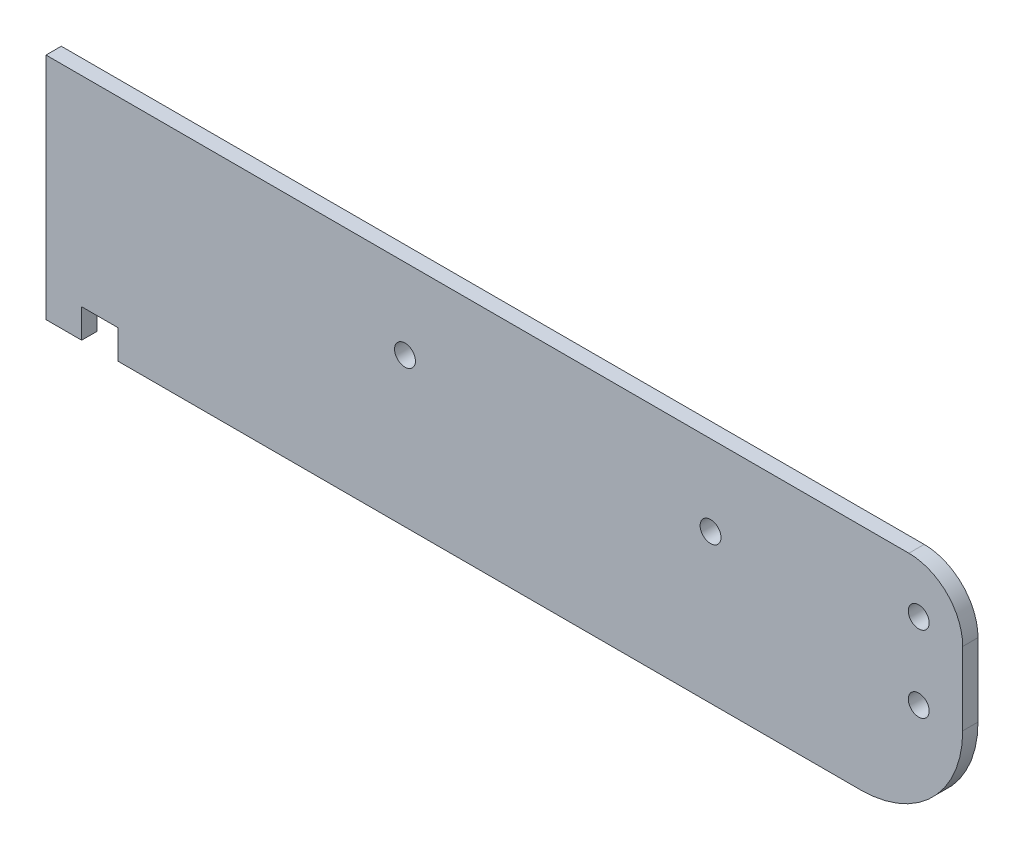
ISO-10303-21;
HEADER;
FILE_DESCRIPTION(('STEP AP214'),'2;1');
FILE_NAME('part.step','',(''),(''),'','','');
FILE_SCHEMA(('AUTOMOTIVE_DESIGN { 1 0 10303 214 1 1 1 1 }'));
ENDSEC;
DATA;
#1=APPLICATION_CONTEXT('core data for automotive mechanical design processes');
#2=APPLICATION_PROTOCOL_DEFINITION('international standard','automotive_design',2000,#1);
#3=PRODUCT_CONTEXT('',#1,'mechanical');
#4=PRODUCT('Part','Part','',(#3));
#5=PRODUCT_RELATED_PRODUCT_CATEGORY('part','',(#4));
#6=PRODUCT_DEFINITION_FORMATION('','',#4);
#7=PRODUCT_DEFINITION_CONTEXT('part definition',#1,'design');
#8=PRODUCT_DEFINITION('design','',#6,#7);
#9=PRODUCT_DEFINITION_SHAPE('','',#8);
#10=(LENGTH_UNIT() NAMED_UNIT(*) SI_UNIT(.MILLI.,.METRE.));
#11=(NAMED_UNIT(*) PLANE_ANGLE_UNIT() SI_UNIT($,.RADIAN.));
#12=(NAMED_UNIT(*) SI_UNIT($,.STERADIAN.) SOLID_ANGLE_UNIT());
#13=UNCERTAINTY_MEASURE_WITH_UNIT(LENGTH_MEASURE(1.E-05),#10,'distance_accuracy_value','');
#14=(GEOMETRIC_REPRESENTATION_CONTEXT(3) GLOBAL_UNCERTAINTY_ASSIGNED_CONTEXT((#13)) GLOBAL_UNIT_ASSIGNED_CONTEXT((#10,
#11,#12)) REPRESENTATION_CONTEXT('',''));
#15=CARTESIAN_POINT('',(0.,0.,0.));
#16=DIRECTION('',(0.,0.,1.));
#17=DIRECTION('',(1.,0.,0.));
#18=AXIS2_PLACEMENT_3D('',#15,#16,#17);
#19=CARTESIAN_POINT('',(0.,-31.6358075953465,3.));
#20=DIRECTION('',(0.,1.,0.));
#21=DIRECTION('',(0.,0.,1.));
#22=AXIS2_PLACEMENT_3D('',#19,#20,#21);
#23=PLANE('',#22);
#24=DIRECTION('',(1.,0.,0.));
#25=VECTOR('',#24,1.);
#26=CARTESIAN_POINT('',(0.,-31.6358075953465,0.));
#27=LINE('',#26,#25);
#28=CARTESIAN_POINT('',(-57.2902399326744,-31.6358075953465,0.));
#29=VERTEX_POINT('',#28);
#30=CARTESIAN_POINT('',(-50.2902399326744,-31.6358075953465,0.));
#31=VERTEX_POINT('',#30);
#32=EDGE_CURVE('E142',#29,#31,#27,.T.);
#33=ORIENTED_EDGE('',*,*,#32,.T.);
#34=DIRECTION('',(0.,0.,-1.));
#35=VECTOR('',#34,1.);
#36=CARTESIAN_POINT('',(-50.2902399326744,-31.6358075953465,3.));
#37=LINE('',#36,#35);
#38=CARTESIAN_POINT('',(-50.2902399326744,-31.6358075953465,3.));
#39=VERTEX_POINT('',#38);
#40=EDGE_CURVE('E126',#39,#31,#37,.T.);
#41=ORIENTED_EDGE('',*,*,#40,.F.);
#42=DIRECTION('',(1.,0.,0.));
#43=VECTOR('',#42,1.);
#44=CARTESIAN_POINT('',(0.,-31.6358075953465,3.));
#45=LINE('',#44,#43);
#46=CARTESIAN_POINT('',(-57.2902399326744,-31.6358075953465,3.));
#47=VERTEX_POINT('',#46);
#48=EDGE_CURVE('E108',#47,#39,#45,.T.);
#49=ORIENTED_EDGE('',*,*,#48,.F.);
#50=DIRECTION('',(0.,0.,-1.));
#51=VECTOR('',#50,1.);
#52=CARTESIAN_POINT('',(-57.2902399326744,-31.6358075953465,3.));
#53=LINE('',#52,#51);
#54=EDGE_CURVE('E115',#47,#29,#53,.T.);
#55=ORIENTED_EDGE('',*,*,#54,.T.);
#56=EDGE_LOOP('',(#33,#41,#49,#55));
#57=FACE_BOUND('',#56,.T.);
#58=ADVANCED_FACE('F36',(#57),#23,.F.);
#59=CARTESIAN_POINT('',(122.709760067326,0.,3.));
#60=DIRECTION('',(1.,0.,0.));
#61=DIRECTION('',(0.,1.,0.));
#62=AXIS2_PLACEMENT_3D('',#59,#60,#61);
#63=PLANE('',#62);
#64=DIRECTION('',(0.,-1.,0.));
#65=VECTOR('',#64,1.);
#66=CARTESIAN_POINT('',(122.709760067326,0.,0.));
#67=LINE('',#66,#65);
#68=CARTESIAN_POINT('',(122.709760067326,2.7925868489384,0.));
#69=VERTEX_POINT('',#68);
#70=CARTESIAN_POINT('',(122.709760067326,-11.560180438309,0.));
#71=VERTEX_POINT('',#70);
#72=EDGE_CURVE('E132',#69,#71,#67,.T.);
#73=ORIENTED_EDGE('',*,*,#72,.F.);
#74=DIRECTION('',(0.,0.,-1.));
#75=VECTOR('',#74,1.);
#76=CARTESIAN_POINT('',(122.709760067326,2.7925868489384,3.));
#77=LINE('',#76,#75);
#78=CARTESIAN_POINT('',(122.709760067326,2.7925868489384,3.));
#79=VERTEX_POINT('',#78);
#80=EDGE_CURVE('E11',#79,#69,#77,.T.);
#81=ORIENTED_EDGE('',*,*,#80,.F.);
#82=DIRECTION('',(0.,-1.,0.));
#83=VECTOR('',#82,1.);
#84=CARTESIAN_POINT('',(122.709760067326,0.,3.));
#85=LINE('',#84,#83);
#86=CARTESIAN_POINT('',(122.709760067326,-11.560180438309,3.));
#87=VERTEX_POINT('',#86);
#88=EDGE_CURVE('E147',#79,#87,#85,.T.);
#89=ORIENTED_EDGE('',*,*,#88,.T.);
#90=DIRECTION('',(0.,0.,-1.));
#91=VECTOR('',#90,1.);
#92=CARTESIAN_POINT('',(122.709760067326,-11.560180438309,3.));
#93=LINE('',#92,#91);
#94=EDGE_CURVE('E60',#87,#71,#93,.T.);
#95=ORIENTED_EDGE('',*,*,#94,.T.);
#96=EDGE_LOOP('',(#73,#81,#89,#95));
#97=FACE_BOUND('',#96,.T.);
#98=ADVANCED_FACE('F38',(#97),#63,.T.);
#99=CARTESIAN_POINT('',(112.138154511611,2.7925868489384,3.));
#100=DIRECTION('',(0.,0.,-1.));
#101=DIRECTION('',(-1.,0.,0.));
#102=AXIS2_PLACEMENT_3D('',#99,#100,#101);
#103=CYLINDRICAL_SURFACE('',#102,10.5716055557151);
#104=CARTESIAN_POINT('',(112.138154511611,2.7925868489384,0.));
#105=DIRECTION('',(0.,0.,1.));
#106=DIRECTION('',(1.,0.,0.));
#107=AXIS2_PLACEMENT_3D('',#104,#105,#106);
#108=CIRCLE('',#107,10.5716055557151);
#109=CARTESIAN_POINT('',(112.138154511611,13.3641924046535,0.));
#110=VERTEX_POINT('',#109);
#111=EDGE_CURVE('E134',#69,#110,#108,.T.);
#112=ORIENTED_EDGE('',*,*,#111,.T.);
#113=DIRECTION('',(0.,0.,-1.));
#114=VECTOR('',#113,1.);
#115=CARTESIAN_POINT('',(112.138154511611,13.3641924046535,3.));
#116=LINE('',#115,#114);
#117=CARTESIAN_POINT('',(112.138154511611,13.3641924046535,3.));
#118=VERTEX_POINT('',#117);
#119=EDGE_CURVE('E44',#118,#110,#116,.T.);
#120=ORIENTED_EDGE('',*,*,#119,.F.);
#121=CARTESIAN_POINT('',(112.138154511611,2.7925868489384,3.));
#122=DIRECTION('',(0.,0.,1.));
#123=DIRECTION('',(1.,0.,0.));
#124=AXIS2_PLACEMENT_3D('',#121,#122,#123);
#125=CIRCLE('',#124,10.5716055557151);
#126=EDGE_CURVE('E210',#79,#118,#125,.T.);
#127=ORIENTED_EDGE('',*,*,#126,.F.);
#128=ORIENTED_EDGE('',*,*,#80,.T.);
#129=EDGE_LOOP('',(#112,#120,#127,#128));
#130=FACE_BOUND('',#129,.T.);
#131=ADVANCED_FACE('F157',(#130),#103,.T.);
#132=CARTESIAN_POINT('',(0.,13.3641924046535,3.));
#133=DIRECTION('',(0.,1.,0.));
#134=DIRECTION('',(0.,0.,1.));
#135=AXIS2_PLACEMENT_3D('',#132,#133,#134);
#136=PLANE('',#135);
#137=DIRECTION('',(1.,0.,0.));
#138=VECTOR('',#137,1.);
#139=CARTESIAN_POINT('',(0.,13.3641924046535,0.));
#140=LINE('',#139,#138);
#141=CARTESIAN_POINT('',(-57.2902399326744,13.3641924046535,0.));
#142=VERTEX_POINT('',#141);
#143=EDGE_CURVE('E137',#142,#110,#140,.T.);
#144=ORIENTED_EDGE('',*,*,#143,.F.);
#145=DIRECTION('',(0.,0.,-1.));
#146=VECTOR('',#145,1.);
#147=CARTESIAN_POINT('',(-57.2902399326744,13.3641924046535,3.));
#148=LINE('',#147,#146);
#149=CARTESIAN_POINT('',(-57.2902399326744,13.3641924046535,3.));
#150=VERTEX_POINT('',#149);
#151=EDGE_CURVE('E122',#150,#142,#148,.T.);
#152=ORIENTED_EDGE('',*,*,#151,.F.);
#153=DIRECTION('',(1.,0.,0.));
#154=VECTOR('',#153,1.);
#155=CARTESIAN_POINT('',(0.,13.3641924046535,3.));
#156=LINE('',#155,#154);
#157=EDGE_CURVE('E110',#150,#118,#156,.T.);
#158=ORIENTED_EDGE('',*,*,#157,.T.);
#159=ORIENTED_EDGE('',*,*,#119,.T.);
#160=EDGE_LOOP('',(#144,#152,#158,#159));
#161=FACE_BOUND('',#160,.T.);
#162=ADVANCED_FACE('F154',(#161),#136,.T.);
#163=CARTESIAN_POINT('',(-57.2902399326744,0.,3.));
#164=DIRECTION('',(1.,0.,0.));
#165=DIRECTION('',(0.,0.,-1.));
#166=AXIS2_PLACEMENT_3D('',#163,#164,#165);
#167=PLANE('',#166);
#168=DIRECTION('',(0.,-1.,0.));
#169=VECTOR('',#168,1.);
#170=CARTESIAN_POINT('',(-57.2902399326744,0.,0.));
#171=LINE('',#170,#169);
#172=EDGE_CURVE('E118',#142,#29,#171,.T.);
#173=ORIENTED_EDGE('',*,*,#172,.T.);
#174=ORIENTED_EDGE('',*,*,#54,.F.);
#175=DIRECTION('',(0.,-1.,0.));
#176=VECTOR('',#175,1.);
#177=CARTESIAN_POINT('',(-57.2902399326744,0.,3.));
#178=LINE('',#177,#176);
#179=EDGE_CURVE('E103',#150,#47,#178,.T.);
#180=ORIENTED_EDGE('',*,*,#179,.F.);
#181=ORIENTED_EDGE('',*,*,#151,.T.);
#182=EDGE_LOOP('',(#173,#174,#180,#181));
#183=FACE_BOUND('',#182,.T.);
#184=ADVANCED_FACE('F116',(#183),#167,.F.);
#185=CARTESIAN_POINT('',(-43.1902399326744,-31.6358075953465,3.));
#186=VERTEX_POINT('',#185);
#187=CARTESIAN_POINT('',(102.634132910288,-31.6358075953465,3.));
#188=VERTEX_POINT('',#187);
#189=EDGE_CURVE('E112',#186,#188,#45,.T.);
#190=ORIENTED_EDGE('',*,*,#189,.F.);
#191=DIRECTION('',(0.,0.,-1.));
#192=VECTOR('',#191,1.);
#193=CARTESIAN_POINT('',(-43.1902399326744,-31.6358075953465,3.));
#194=LINE('',#193,#192);
#195=CARTESIAN_POINT('',(-43.1902399326744,-31.6358075953465,0.));
#196=VERTEX_POINT('',#195);
#197=EDGE_CURVE('E189',#186,#196,#194,.T.);
#198=ORIENTED_EDGE('',*,*,#197,.T.);
#199=CARTESIAN_POINT('',(102.634132910288,-31.6358075953465,0.));
#200=VERTEX_POINT('',#199);
#201=EDGE_CURVE('E141',#196,#200,#27,.T.);
#202=ORIENTED_EDGE('',*,*,#201,.T.);
#203=DIRECTION('',(0.,0.,-1.));
#204=VECTOR('',#203,1.);
#205=CARTESIAN_POINT('',(102.634132910288,-31.6358075953465,3.));
#206=LINE('',#205,#204);
#207=EDGE_CURVE('E123',#188,#200,#206,.T.);
#208=ORIENTED_EDGE('',*,*,#207,.F.);
#209=EDGE_LOOP('',(#190,#198,#202,#208));
#210=FACE_BOUND('',#209,.T.);
#211=ADVANCED_FACE('F219',(#210),#23,.F.);
#212=CARTESIAN_POINT('',(102.634132910288,-11.560180438309,3.));
#213=DIRECTION('',(0.,0.,-1.));
#214=DIRECTION('',(-1.,0.,0.));
#215=AXIS2_PLACEMENT_3D('',#212,#213,#214);
#216=CYLINDRICAL_SURFACE('',#215,20.0756271570376);
#217=CARTESIAN_POINT('',(102.634132910288,-11.560180438309,0.));
#218=DIRECTION('',(0.,0.,1.));
#219=DIRECTION('',(1.,0.,0.));
#220=AXIS2_PLACEMENT_3D('',#217,#218,#219);
#221=CIRCLE('',#220,20.0756271570376);
#222=EDGE_CURVE('E144',#71,#200,#221,.F.);
#223=ORIENTED_EDGE('',*,*,#222,.F.);
#224=ORIENTED_EDGE('',*,*,#94,.F.);
#225=CARTESIAN_POINT('',(102.634132910288,-11.560180438309,3.));
#226=DIRECTION('',(0.,0.,1.));
#227=DIRECTION('',(1.,0.,0.));
#228=AXIS2_PLACEMENT_3D('',#225,#226,#227);
#229=CIRCLE('',#228,20.0756271570376);
#230=EDGE_CURVE('E127',#87,#188,#229,.F.);
#231=ORIENTED_EDGE('',*,*,#230,.T.);
#232=ORIENTED_EDGE('',*,*,#207,.T.);
#233=EDGE_LOOP('',(#223,#224,#231,#232));
#234=FACE_BOUND('',#233,.T.);
#235=ADVANCED_FACE('F225',(#234),#216,.T.);
#236=CARTESIAN_POINT('',(0.,0.,3.));
#237=DIRECTION('',(0.,0.,1.));
#238=DIRECTION('',(1.,0.,0.));
#239=AXIS2_PLACEMENT_3D('',#236,#237,#238);
#240=PLANE('',#239);
#241=CARTESIAN_POINT('',(114.073037192605,3.50703395595707,3.));
#242=DIRECTION('',(0.,0.,-1.));
#243=DIRECTION('',(-1.,0.,0.));
#244=AXIS2_PLACEMENT_3D('',#241,#242,#243);
#245=CIRCLE('',#244,2.04999999999999);
#246=CARTESIAN_POINT('',(112.023037192605,3.50703395595707,3.));
#247=VERTEX_POINT('',#246);
#248=EDGE_CURVE('E203',#247,#247,#245,.T.);
#249=ORIENTED_EDGE('',*,*,#248,.T.);
#250=EDGE_LOOP('',(#249));
#251=FACE_BOUND('',#250,.T.);
#252=CARTESIAN_POINT('',(73.1986291942406,-2.41940962454892,3.));
#253=DIRECTION('',(0.,0.,-1.));
#254=DIRECTION('',(-1.,0.,0.));
#255=AXIS2_PLACEMENT_3D('',#252,#253,#254);
#256=CIRCLE('',#255,2.04999999999999);
#257=CARTESIAN_POINT('',(71.1486291942406,-2.41940962454892,3.));
#258=VERTEX_POINT('',#257);
#259=EDGE_CURVE('E368',#258,#258,#256,.T.);
#260=ORIENTED_EDGE('',*,*,#259,.T.);
#261=EDGE_LOOP('',(#260));
#262=FACE_BOUND('',#261,.T.);
#263=CARTESIAN_POINT('',(114.073037192605,-11.4929660440429,3.));
#264=DIRECTION('',(0.,0.,-1.));
#265=DIRECTION('',(-1.,0.,0.));
#266=AXIS2_PLACEMENT_3D('',#263,#264,#265);
#267=CIRCLE('',#266,2.04999999999999);
#268=CARTESIAN_POINT('',(112.023037192605,-11.4929660440429,3.));
#269=VERTEX_POINT('',#268);
#270=EDGE_CURVE('E377',#269,#269,#267,.T.);
#271=ORIENTED_EDGE('',*,*,#270,.T.);
#272=EDGE_LOOP('',(#271));
#273=FACE_BOUND('',#272,.T.);
#274=CARTESIAN_POINT('',(13.1986291942406,-2.41940962454892,3.));
#275=DIRECTION('',(0.,0.,-1.));
#276=DIRECTION('',(-1.,0.,0.));
#277=AXIS2_PLACEMENT_3D('',#274,#275,#276);
#278=CIRCLE('',#277,2.04999999999999);
#279=CARTESIAN_POINT('',(11.1486291942406,-2.41940962454892,3.));
#280=VERTEX_POINT('',#279);
#281=EDGE_CURVE('E383',#280,#280,#278,.T.);
#282=ORIENTED_EDGE('',*,*,#281,.T.);
#283=EDGE_LOOP('',(#282));
#284=FACE_BOUND('',#283,.T.);
#285=DIRECTION('',(0.,1.,0.));
#286=VECTOR('',#285,1.);
#287=CARTESIAN_POINT('',(-50.2902399326744,-31.6358075953465,3.));
#288=LINE('',#287,#286);
#289=CARTESIAN_POINT('',(-50.2902399326744,-25.9358075953465,3.));
#290=VERTEX_POINT('',#289);
#291=EDGE_CURVE('E197',#39,#290,#288,.T.);
#292=ORIENTED_EDGE('',*,*,#291,.T.);
#293=DIRECTION('',(1.,0.,0.));
#294=VECTOR('',#293,1.);
#295=CARTESIAN_POINT('',(-50.2902399326744,-25.9358075953465,3.));
#296=LINE('',#295,#294);
#297=CARTESIAN_POINT('',(-43.1902399326744,-25.9358075953465,3.));
#298=VERTEX_POINT('',#297);
#299=EDGE_CURVE('E187',#290,#298,#296,.T.);
#300=ORIENTED_EDGE('',*,*,#299,.T.);
#301=DIRECTION('',(0.,-1.,0.));
#302=VECTOR('',#301,1.);
#303=CARTESIAN_POINT('',(-43.1902399326744,-31.6358075953465,3.));
#304=LINE('',#303,#302);
#305=EDGE_CURVE('E193',#298,#186,#304,.T.);
#306=ORIENTED_EDGE('',*,*,#305,.T.);
#307=ORIENTED_EDGE('',*,*,#189,.T.);
#308=ORIENTED_EDGE('',*,*,#230,.F.);
#309=ORIENTED_EDGE('',*,*,#88,.F.);
#310=ORIENTED_EDGE('',*,*,#126,.T.);
#311=ORIENTED_EDGE('',*,*,#157,.F.);
#312=ORIENTED_EDGE('',*,*,#179,.T.);
#313=ORIENTED_EDGE('',*,*,#48,.T.);
#314=EDGE_LOOP('',(#292,#300,#306,#307,#308,#309,#310,#311,#312,#313));
#315=FACE_BOUND('',#314,.T.);
#316=ADVANCED_FACE('F106',(#251,#262,#273,#284,#315),#240,.T.);
#317=CARTESIAN_POINT('',(0.,0.,0.));
#318=DIRECTION('',(0.,0.,1.));
#319=DIRECTION('',(1.,0.,0.));
#320=AXIS2_PLACEMENT_3D('',#317,#318,#319);
#321=PLANE('',#320);
#322=CARTESIAN_POINT('',(114.073037192605,3.50703395595707,0.));
#323=DIRECTION('',(0.,0.,-1.));
#324=DIRECTION('',(-1.,0.,0.));
#325=AXIS2_PLACEMENT_3D('',#322,#323,#324);
#326=CIRCLE('',#325,2.04999999999999);
#327=CARTESIAN_POINT('',(112.023037192605,3.50703395595707,0.));
#328=VERTEX_POINT('',#327);
#329=EDGE_CURVE('E367',#328,#328,#326,.T.);
#330=ORIENTED_EDGE('',*,*,#329,.F.);
#331=EDGE_LOOP('',(#330));
#332=FACE_BOUND('',#331,.T.);
#333=CARTESIAN_POINT('',(73.1986291942406,-2.41940962454892,0.));
#334=DIRECTION('',(0.,0.,-1.));
#335=DIRECTION('',(-1.,0.,0.));
#336=AXIS2_PLACEMENT_3D('',#333,#334,#335);
#337=CIRCLE('',#336,2.04999999999999);
#338=CARTESIAN_POINT('',(71.1486291942406,-2.41940962454892,0.));
#339=VERTEX_POINT('',#338);
#340=EDGE_CURVE('E372',#339,#339,#337,.T.);
#341=ORIENTED_EDGE('',*,*,#340,.F.);
#342=EDGE_LOOP('',(#341));
#343=FACE_BOUND('',#342,.T.);
#344=CARTESIAN_POINT('',(114.073037192605,-11.4929660440429,0.));
#345=DIRECTION('',(0.,0.,-1.));
#346=DIRECTION('',(-1.,0.,0.));
#347=AXIS2_PLACEMENT_3D('',#344,#345,#346);
#348=CIRCLE('',#347,2.04999999999999);
#349=CARTESIAN_POINT('',(112.023037192605,-11.4929660440429,0.));
#350=VERTEX_POINT('',#349);
#351=EDGE_CURVE('E380',#350,#350,#348,.T.);
#352=ORIENTED_EDGE('',*,*,#351,.F.);
#353=EDGE_LOOP('',(#352));
#354=FACE_BOUND('',#353,.T.);
#355=CARTESIAN_POINT('',(13.1986291942406,-2.41940962454892,0.));
#356=DIRECTION('',(0.,0.,-1.));
#357=DIRECTION('',(-1.,0.,0.));
#358=AXIS2_PLACEMENT_3D('',#355,#356,#357);
#359=CIRCLE('',#358,2.04999999999999);
#360=CARTESIAN_POINT('',(11.1486291942406,-2.41940962454892,0.));
#361=VERTEX_POINT('',#360);
#362=EDGE_CURVE('E385',#361,#361,#359,.T.);
#363=ORIENTED_EDGE('',*,*,#362,.F.);
#364=EDGE_LOOP('',(#363));
#365=FACE_BOUND('',#364,.T.);
#366=DIRECTION('',(1.,0.,0.));
#367=VECTOR('',#366,1.);
#368=CARTESIAN_POINT('',(-50.2902399326744,-25.9358075953465,0.));
#369=LINE('',#368,#367);
#370=CARTESIAN_POINT('',(-50.2902399326744,-25.9358075953465,0.));
#371=VERTEX_POINT('',#370);
#372=CARTESIAN_POINT('',(-43.1902399326744,-25.9358075953465,0.));
#373=VERTEX_POINT('',#372);
#374=EDGE_CURVE('E188',#371,#373,#369,.T.);
#375=ORIENTED_EDGE('',*,*,#374,.F.);
#376=DIRECTION('',(0.,1.,0.));
#377=VECTOR('',#376,1.);
#378=CARTESIAN_POINT('',(-50.2902399326744,-31.6358075953465,0.));
#379=LINE('',#378,#377);
#380=EDGE_CURVE('E51',#31,#371,#379,.T.);
#381=ORIENTED_EDGE('',*,*,#380,.F.);
#382=ORIENTED_EDGE('',*,*,#32,.F.);
#383=ORIENTED_EDGE('',*,*,#172,.F.);
#384=ORIENTED_EDGE('',*,*,#143,.T.);
#385=ORIENTED_EDGE('',*,*,#111,.F.);
#386=ORIENTED_EDGE('',*,*,#72,.T.);
#387=ORIENTED_EDGE('',*,*,#222,.T.);
#388=ORIENTED_EDGE('',*,*,#201,.F.);
#389=DIRECTION('',(0.,-1.,0.));
#390=VECTOR('',#389,1.);
#391=CARTESIAN_POINT('',(-43.1902399326744,-31.6358075953465,0.));
#392=LINE('',#391,#390);
#393=EDGE_CURVE('E172',#373,#196,#392,.T.);
#394=ORIENTED_EDGE('',*,*,#393,.F.);
#395=EDGE_LOOP('',(#375,#381,#382,#383,#384,#385,#386,#387,#388,#394));
#396=FACE_BOUND('',#395,.T.);
#397=ADVANCED_FACE('F160',(#332,#343,#354,#365,#396),#321,.F.);
#398=CARTESIAN_POINT('',(-50.2902399326744,-31.6358075953465,3.));
#399=DIRECTION('',(-1.,0.,0.));
#400=DIRECTION('',(0.,0.,1.));
#401=AXIS2_PLACEMENT_3D('',#398,#399,#400);
#402=PLANE('',#401);
#403=ORIENTED_EDGE('',*,*,#380,.T.);
#404=DIRECTION('',(0.,0.,-1.));
#405=VECTOR('',#404,1.);
#406=CARTESIAN_POINT('',(-50.2902399326744,-25.9358075953465,3.));
#407=LINE('',#406,#405);
#408=EDGE_CURVE('E190',#290,#371,#407,.T.);
#409=ORIENTED_EDGE('',*,*,#408,.F.);
#410=ORIENTED_EDGE('',*,*,#291,.F.);
#411=ORIENTED_EDGE('',*,*,#40,.T.);
#412=EDGE_LOOP('',(#403,#409,#410,#411));
#413=FACE_BOUND('',#412,.T.);
#414=ADVANCED_FACE('F289',(#413),#402,.F.);
#415=CARTESIAN_POINT('',(-43.1902399326744,-31.6358075953465,3.));
#416=DIRECTION('',(1.,0.,0.));
#417=DIRECTION('',(0.,0.,-1.));
#418=AXIS2_PLACEMENT_3D('',#415,#416,#417);
#419=PLANE('',#418);
#420=ORIENTED_EDGE('',*,*,#393,.T.);
#421=ORIENTED_EDGE('',*,*,#197,.F.);
#422=ORIENTED_EDGE('',*,*,#305,.F.);
#423=DIRECTION('',(0.,0.,-1.));
#424=VECTOR('',#423,1.);
#425=CARTESIAN_POINT('',(-43.1902399326744,-25.9358075953465,3.));
#426=LINE('',#425,#424);
#427=EDGE_CURVE('E183',#298,#373,#426,.T.);
#428=ORIENTED_EDGE('',*,*,#427,.T.);
#429=EDGE_LOOP('',(#420,#421,#422,#428));
#430=FACE_BOUND('',#429,.T.);
#431=ADVANCED_FACE('F194',(#430),#419,.F.);
#432=CARTESIAN_POINT('',(-50.2902399326744,-25.9358075953465,3.));
#433=DIRECTION('',(0.,1.,0.));
#434=DIRECTION('',(-1.,0.,0.));
#435=AXIS2_PLACEMENT_3D('',#432,#433,#434);
#436=PLANE('',#435);
#437=ORIENTED_EDGE('',*,*,#374,.T.);
#438=ORIENTED_EDGE('',*,*,#427,.F.);
#439=ORIENTED_EDGE('',*,*,#299,.F.);
#440=ORIENTED_EDGE('',*,*,#408,.T.);
#441=EDGE_LOOP('',(#437,#438,#439,#440));
#442=FACE_BOUND('',#441,.T.);
#443=ADVANCED_FACE('F185',(#442),#436,.F.);
#444=CARTESIAN_POINT('',(13.1986291942406,-2.41940962454892,3.));
#445=DIRECTION('',(0.,0.,-1.));
#446=DIRECTION('',(-1.,0.,0.));
#447=AXIS2_PLACEMENT_3D('',#444,#445,#446);
#448=CYLINDRICAL_SURFACE('',#447,2.04999999999999);
#449=ORIENTED_EDGE('',*,*,#281,.F.);
#450=EDGE_LOOP('',(#449));
#451=FACE_BOUND('',#450,.T.);
#452=ORIENTED_EDGE('',*,*,#362,.T.);
#453=EDGE_LOOP('',(#452));
#454=FACE_BOUND('',#453,.T.);
#455=ADVANCED_FACE('F315',(#451,#454),#448,.F.);
#456=CARTESIAN_POINT('',(114.073037192605,-11.4929660440429,3.));
#457=DIRECTION('',(0.,0.,-1.));
#458=DIRECTION('',(-1.,0.,0.));
#459=AXIS2_PLACEMENT_3D('',#456,#457,#458);
#460=CYLINDRICAL_SURFACE('',#459,2.04999999999999);
#461=ORIENTED_EDGE('',*,*,#270,.F.);
#462=EDGE_LOOP('',(#461));
#463=FACE_BOUND('',#462,.T.);
#464=ORIENTED_EDGE('',*,*,#351,.T.);
#465=EDGE_LOOP('',(#464));
#466=FACE_BOUND('',#465,.T.);
#467=ADVANCED_FACE('F322',(#463,#466),#460,.F.);
#468=CARTESIAN_POINT('',(73.1986291942406,-2.41940962454892,3.));
#469=DIRECTION('',(0.,0.,-1.));
#470=DIRECTION('',(-1.,0.,0.));
#471=AXIS2_PLACEMENT_3D('',#468,#469,#470);
#472=CYLINDRICAL_SURFACE('',#471,2.04999999999999);
#473=ORIENTED_EDGE('',*,*,#259,.F.);
#474=EDGE_LOOP('',(#473));
#475=FACE_BOUND('',#474,.T.);
#476=ORIENTED_EDGE('',*,*,#340,.T.);
#477=EDGE_LOOP('',(#476));
#478=FACE_BOUND('',#477,.T.);
#479=ADVANCED_FACE('F331',(#475,#478),#472,.F.);
#480=CARTESIAN_POINT('',(114.073037192605,3.50703395595707,3.));
#481=DIRECTION('',(0.,0.,-1.));
#482=DIRECTION('',(-1.,0.,0.));
#483=AXIS2_PLACEMENT_3D('',#480,#481,#482);
#484=CYLINDRICAL_SURFACE('',#483,2.04999999999999);
#485=ORIENTED_EDGE('',*,*,#248,.F.);
#486=EDGE_LOOP('',(#485));
#487=FACE_BOUND('',#486,.T.);
#488=ORIENTED_EDGE('',*,*,#329,.T.);
#489=EDGE_LOOP('',(#488));
#490=FACE_BOUND('',#489,.T.);
#491=ADVANCED_FACE('F340',(#487,#490),#484,.F.);
#492=CLOSED_SHELL('',(#58,#98,#131,#162,#184,#211,#235,#316,#397,#414,#431,#443,#455,#467,#479,#491));
#493=MANIFOLD_SOLID_BREP('B2',#492);
#494=ADVANCED_BREP_SHAPE_REPRESENTATION('',(#18,#493),#14);
#495=SHAPE_DEFINITION_REPRESENTATION(#9,#494);
ENDSEC;
END-ISO-10303-21;
